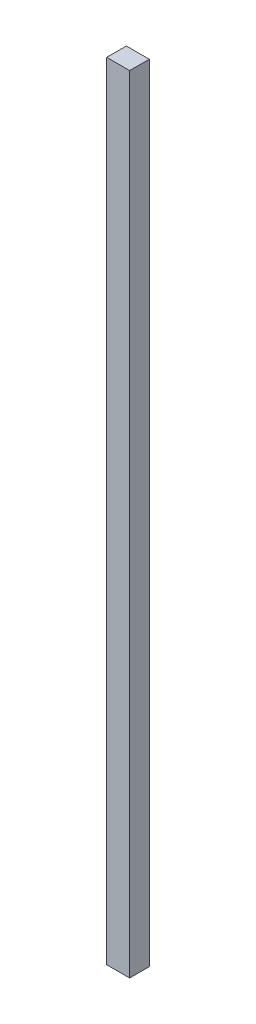
ISO-10303-21;
HEADER;
FILE_DESCRIPTION(('STEP AP214'),'2;1');
FILE_NAME('part.step','',(''),(''),'','','');
FILE_SCHEMA(('AUTOMOTIVE_DESIGN { 1 0 10303 214 1 1 1 1 }'));
ENDSEC;
DATA;
#1=APPLICATION_CONTEXT('core data for automotive mechanical design processes');
#2=APPLICATION_PROTOCOL_DEFINITION('international standard','automotive_design',2000,#1);
#3=PRODUCT_CONTEXT('',#1,'mechanical');
#4=PRODUCT('Part','Part','',(#3));
#5=PRODUCT_RELATED_PRODUCT_CATEGORY('part','',(#4));
#6=PRODUCT_DEFINITION_FORMATION('','',#4);
#7=PRODUCT_DEFINITION_CONTEXT('part definition',#1,'design');
#8=PRODUCT_DEFINITION('design','',#6,#7);
#9=PRODUCT_DEFINITION_SHAPE('','',#8);
#10=(LENGTH_UNIT() NAMED_UNIT(*) SI_UNIT(.MILLI.,.METRE.));
#11=(NAMED_UNIT(*) PLANE_ANGLE_UNIT() SI_UNIT($,.RADIAN.));
#12=(NAMED_UNIT(*) SI_UNIT($,.STERADIAN.) SOLID_ANGLE_UNIT());
#13=UNCERTAINTY_MEASURE_WITH_UNIT(LENGTH_MEASURE(1.E-05),#10,'distance_accuracy_value','');
#14=(GEOMETRIC_REPRESENTATION_CONTEXT(3) GLOBAL_UNCERTAINTY_ASSIGNED_CONTEXT((#13)) GLOBAL_UNIT_ASSIGNED_CONTEXT((#10,
#11,#12)) REPRESENTATION_CONTEXT('',''));
#15=CARTESIAN_POINT('',(0.,0.,0.));
#16=DIRECTION('',(0.,0.,1.));
#17=DIRECTION('',(1.,0.,0.));
#18=AXIS2_PLACEMENT_3D('',#15,#16,#17);
#19=CARTESIAN_POINT('',(-1.74999999999999,-60.,3.));
#20=DIRECTION('',(0.,1.,0.));
#21=DIRECTION('',(0.,0.,1.));
#22=AXIS2_PLACEMENT_3D('',#19,#20,#21);
#23=PLANE('',#22);
#24=DIRECTION('',(1.,0.,0.));
#25=VECTOR('',#24,1.);
#26=CARTESIAN_POINT('',(-1.74999999999999,-60.,0.));
#27=LINE('',#26,#25);
#28=CARTESIAN_POINT('',(-1.74999999999999,-60.,0.));
#29=VERTEX_POINT('',#28);
#30=CARTESIAN_POINT('',(1.75000000000001,-60.,0.));
#31=VERTEX_POINT('',#30);
#32=EDGE_CURVE('E136',#29,#31,#27,.T.);
#33=ORIENTED_EDGE('',*,*,#32,.T.);
#34=DIRECTION('',(0.,0.,-1.));
#35=VECTOR('',#34,1.);
#36=CARTESIAN_POINT('',(1.75000000000001,-60.,3.));
#37=LINE('',#36,#35);
#38=CARTESIAN_POINT('',(1.75000000000001,-60.,3.));
#39=VERTEX_POINT('',#38);
#40=EDGE_CURVE('E12',#39,#31,#37,.T.);
#41=ORIENTED_EDGE('',*,*,#40,.F.);
#42=DIRECTION('',(1.,0.,0.));
#43=VECTOR('',#42,1.);
#44=CARTESIAN_POINT('',(-1.74999999999999,-60.,3.));
#45=LINE('',#44,#43);
#46=CARTESIAN_POINT('',(-1.74999999999999,-60.,3.));
#47=VERTEX_POINT('',#46);
#48=EDGE_CURVE('E100',#47,#39,#45,.T.);
#49=ORIENTED_EDGE('',*,*,#48,.F.);
#50=DIRECTION('',(0.,0.,-1.));
#51=VECTOR('',#50,1.);
#52=CARTESIAN_POINT('',(-1.74999999999999,-60.,3.));
#53=LINE('',#52,#51);
#54=EDGE_CURVE('E112',#47,#29,#53,.T.);
#55=ORIENTED_EDGE('',*,*,#54,.T.);
#56=EDGE_LOOP('',(#33,#41,#49,#55));
#57=FACE_BOUND('',#56,.T.);
#58=ADVANCED_FACE('F48',(#57),#23,.F.);
#59=CARTESIAN_POINT('',(1.74999999999999,60.,3.));
#60=DIRECTION('',(-1.,0.,0.));
#61=DIRECTION('',(0.,-1.,0.));
#62=AXIS2_PLACEMENT_3D('',#59,#60,#61);
#63=PLANE('',#62);
#64=DIRECTION('',(0.,1.,0.));
#65=VECTOR('',#64,1.);
#66=CARTESIAN_POINT('',(1.74999999999999,60.,0.));
#67=LINE('',#66,#65);
#68=CARTESIAN_POINT('',(1.74999999999999,60.,0.));
#69=VERTEX_POINT('',#68);
#70=EDGE_CURVE('E105',#31,#69,#67,.T.);
#71=ORIENTED_EDGE('',*,*,#70,.T.);
#72=DIRECTION('',(0.,0.,-1.));
#73=VECTOR('',#72,1.);
#74=CARTESIAN_POINT('',(1.74999999999999,60.,3.));
#75=LINE('',#74,#73);
#76=CARTESIAN_POINT('',(1.74999999999999,60.,3.));
#77=VERTEX_POINT('',#76);
#78=EDGE_CURVE('E57',#77,#69,#75,.T.);
#79=ORIENTED_EDGE('',*,*,#78,.F.);
#80=DIRECTION('',(0.,1.,0.));
#81=VECTOR('',#80,1.);
#82=CARTESIAN_POINT('',(1.74999999999999,60.,3.));
#83=LINE('',#82,#81);
#84=EDGE_CURVE('E95',#39,#77,#83,.T.);
#85=ORIENTED_EDGE('',*,*,#84,.F.);
#86=ORIENTED_EDGE('',*,*,#40,.T.);
#87=EDGE_LOOP('',(#71,#79,#85,#86));
#88=FACE_BOUND('',#87,.T.);
#89=ADVANCED_FACE('F104',(#88),#63,.F.);
#90=CARTESIAN_POINT('',(-1.75000000000001,60.,3.));
#91=DIRECTION('',(0.,-1.,0.));
#92=DIRECTION('',(0.,0.,-1.));
#93=AXIS2_PLACEMENT_3D('',#90,#91,#92);
#94=PLANE('',#93);
#95=DIRECTION('',(-1.,0.,0.));
#96=VECTOR('',#95,1.);
#97=CARTESIAN_POINT('',(-1.75000000000001,60.,0.));
#98=LINE('',#97,#96);
#99=CARTESIAN_POINT('',(-1.75000000000001,60.,0.));
#100=VERTEX_POINT('',#99);
#101=EDGE_CURVE('E82',#69,#100,#98,.T.);
#102=ORIENTED_EDGE('',*,*,#101,.T.);
#103=DIRECTION('',(0.,0.,-1.));
#104=VECTOR('',#103,1.);
#105=CARTESIAN_POINT('',(-1.75000000000001,60.,3.));
#106=LINE('',#105,#104);
#107=CARTESIAN_POINT('',(-1.75000000000001,60.,3.));
#108=VERTEX_POINT('',#107);
#109=EDGE_CURVE('E107',#108,#100,#106,.T.);
#110=ORIENTED_EDGE('',*,*,#109,.F.);
#111=DIRECTION('',(-1.,0.,0.));
#112=VECTOR('',#111,1.);
#113=CARTESIAN_POINT('',(-1.75000000000001,60.,3.));
#114=LINE('',#113,#112);
#115=EDGE_CURVE('E98',#77,#108,#114,.T.);
#116=ORIENTED_EDGE('',*,*,#115,.F.);
#117=ORIENTED_EDGE('',*,*,#78,.T.);
#118=EDGE_LOOP('',(#102,#110,#116,#117));
#119=FACE_BOUND('',#118,.T.);
#120=ADVANCED_FACE('F108',(#119),#94,.F.);
#121=CARTESIAN_POINT('',(-1.75000000000001,60.,3.));
#122=DIRECTION('',(1.,0.,0.));
#123=DIRECTION('',(0.,1.,0.));
#124=AXIS2_PLACEMENT_3D('',#121,#122,#123);
#125=PLANE('',#124);
#126=DIRECTION('',(0.,-1.,0.));
#127=VECTOR('',#126,1.);
#128=CARTESIAN_POINT('',(-1.75000000000001,60.,0.));
#129=LINE('',#128,#127);
#130=EDGE_CURVE('E88',#100,#29,#129,.T.);
#131=ORIENTED_EDGE('',*,*,#130,.T.);
#132=ORIENTED_EDGE('',*,*,#54,.F.);
#133=DIRECTION('',(0.,-1.,0.));
#134=VECTOR('',#133,1.);
#135=CARTESIAN_POINT('',(-1.75000000000001,60.,3.));
#136=LINE('',#135,#134);
#137=EDGE_CURVE('E65',#108,#47,#136,.T.);
#138=ORIENTED_EDGE('',*,*,#137,.F.);
#139=ORIENTED_EDGE('',*,*,#109,.T.);
#140=EDGE_LOOP('',(#131,#132,#138,#139));
#141=FACE_BOUND('',#140,.T.);
#142=ADVANCED_FACE('F131',(#141),#125,.F.);
#143=CARTESIAN_POINT('',(0.,0.,3.));
#144=DIRECTION('',(0.,0.,-1.));
#145=DIRECTION('',(-1.,0.,0.));
#146=AXIS2_PLACEMENT_3D('',#143,#144,#145);
#147=PLANE('',#146);
#148=ORIENTED_EDGE('',*,*,#48,.T.);
#149=ORIENTED_EDGE('',*,*,#84,.T.);
#150=ORIENTED_EDGE('',*,*,#115,.T.);
#151=ORIENTED_EDGE('',*,*,#137,.T.);
#152=EDGE_LOOP('',(#148,#149,#150,#151));
#153=FACE_BOUND('',#152,.T.);
#154=ADVANCED_FACE('F96',(#153),#147,.F.);
#155=CARTESIAN_POINT('',(0.,0.,0.));
#156=DIRECTION('',(0.,0.,-1.));
#157=DIRECTION('',(-1.,0.,0.));
#158=AXIS2_PLACEMENT_3D('',#155,#156,#157);
#159=PLANE('',#158);
#160=ORIENTED_EDGE('',*,*,#32,.F.);
#161=ORIENTED_EDGE('',*,*,#130,.F.);
#162=ORIENTED_EDGE('',*,*,#101,.F.);
#163=ORIENTED_EDGE('',*,*,#70,.F.);
#164=EDGE_LOOP('',(#160,#161,#162,#163));
#165=FACE_BOUND('',#164,.T.);
#166=ADVANCED_FACE('F134',(#165),#159,.T.);
#167=CLOSED_SHELL('',(#58,#89,#120,#142,#154,#166));
#168=MANIFOLD_SOLID_BREP('B2',#167);
#169=ADVANCED_BREP_SHAPE_REPRESENTATION('',(#18,#168),#14);
#170=SHAPE_DEFINITION_REPRESENTATION(#9,#169);
ENDSEC;
END-ISO-10303-21;
